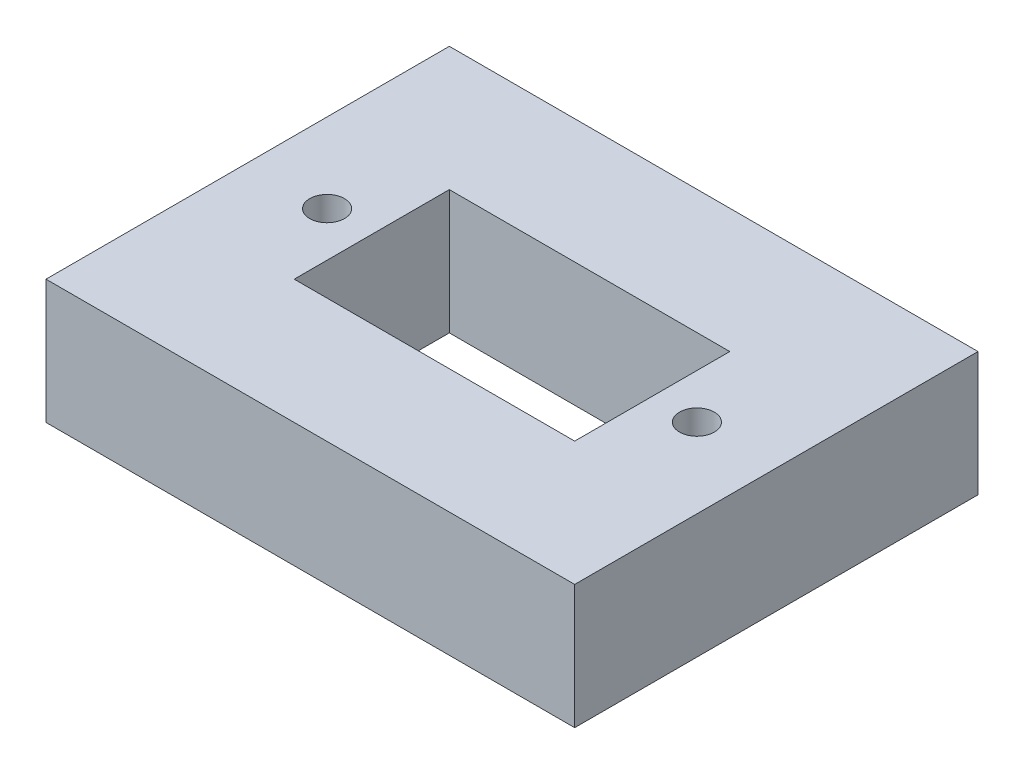
ISO-10303-21;
HEADER;
FILE_DESCRIPTION(('STEP AP214'),'2;1');
FILE_NAME('part.step','',(''),(''),'','','');
FILE_SCHEMA(('AUTOMOTIVE_DESIGN { 1 0 10303 214 1 1 1 1 }'));
ENDSEC;
DATA;
#1=APPLICATION_CONTEXT('core data for automotive mechanical design processes');
#2=APPLICATION_PROTOCOL_DEFINITION('international standard','automotive_design',2000,#1);
#3=PRODUCT_CONTEXT('',#1,'mechanical');
#4=PRODUCT('Part','Part','',(#3));
#5=PRODUCT_RELATED_PRODUCT_CATEGORY('part','',(#4));
#6=PRODUCT_DEFINITION_FORMATION('','',#4);
#7=PRODUCT_DEFINITION_CONTEXT('part definition',#1,'design');
#8=PRODUCT_DEFINITION('design','',#6,#7);
#9=PRODUCT_DEFINITION_SHAPE('','',#8);
#10=(LENGTH_UNIT() NAMED_UNIT(*) SI_UNIT(.MILLI.,.METRE.));
#11=(NAMED_UNIT(*) PLANE_ANGLE_UNIT() SI_UNIT($,.RADIAN.));
#12=(NAMED_UNIT(*) SI_UNIT($,.STERADIAN.) SOLID_ANGLE_UNIT());
#13=UNCERTAINTY_MEASURE_WITH_UNIT(LENGTH_MEASURE(1.E-05),#10,'distance_accuracy_value','');
#14=(GEOMETRIC_REPRESENTATION_CONTEXT(3) GLOBAL_UNCERTAINTY_ASSIGNED_CONTEXT((#13)) GLOBAL_UNIT_ASSIGNED_CONTEXT((#10,
#11,#12)) REPRESENTATION_CONTEXT('',''));
#15=CARTESIAN_POINT('',(0.,0.,0.));
#16=DIRECTION('',(0.,0.,1.));
#17=DIRECTION('',(1.,0.,0.));
#18=AXIS2_PLACEMENT_3D('',#15,#16,#17);
#19=CARTESIAN_POINT('',(0.,10.,0.));
#20=DIRECTION('',(0.,1.,0.));
#21=DIRECTION('',(0.,0.,1.));
#22=AXIS2_PLACEMENT_3D('',#19,#20,#21);
#23=PLANE('',#22);
#24=CARTESIAN_POINT('',(-14.9,10.,0.));
#25=DIRECTION('',(0.,1.,0.));
#26=DIRECTION('',(0.,0.,1.));
#27=AXIS2_PLACEMENT_3D('',#24,#25,#26);
#28=CIRCLE('',#27,1.4);
#29=CARTESIAN_POINT('',(-14.9,10.,1.4));
#30=VERTEX_POINT('',#29);
#31=EDGE_CURVE('E130',#30,#30,#28,.T.);
#32=ORIENTED_EDGE('',*,*,#31,.F.);
#33=EDGE_LOOP('',(#32));
#34=FACE_BOUND('',#33,.T.);
#35=DIRECTION('',(1.,0.,0.));
#36=VECTOR('',#35,1.);
#37=CARTESIAN_POINT('',(-21.3,10.,16.25));
#38=LINE('',#37,#36);
#39=CARTESIAN_POINT('',(-21.3,10.,16.25));
#40=VERTEX_POINT('',#39);
#41=CARTESIAN_POINT('',(21.3,10.,16.25));
#42=VERTEX_POINT('',#41);
#43=EDGE_CURVE('E140',#40,#42,#38,.T.);
#44=ORIENTED_EDGE('',*,*,#43,.T.);
#45=DIRECTION('',(0.,0.,-1.));
#46=VECTOR('',#45,1.);
#47=CARTESIAN_POINT('',(21.3,10.,16.25));
#48=LINE('',#47,#46);
#49=CARTESIAN_POINT('',(21.3,10.,-16.25));
#50=VERTEX_POINT('',#49);
#51=EDGE_CURVE('E143',#42,#50,#48,.T.);
#52=ORIENTED_EDGE('',*,*,#51,.T.);
#53=DIRECTION('',(-1.,0.,0.));
#54=VECTOR('',#53,1.);
#55=CARTESIAN_POINT('',(-21.3,10.,-16.25));
#56=LINE('',#55,#54);
#57=CARTESIAN_POINT('',(-21.3,10.,-16.25));
#58=VERTEX_POINT('',#57);
#59=EDGE_CURVE('E146',#50,#58,#56,.T.);
#60=ORIENTED_EDGE('',*,*,#59,.T.);
#61=DIRECTION('',(0.,0.,1.));
#62=VECTOR('',#61,1.);
#63=CARTESIAN_POINT('',(-21.3,10.,16.25));
#64=LINE('',#63,#62);
#65=EDGE_CURVE('E148',#58,#40,#64,.T.);
#66=ORIENTED_EDGE('',*,*,#65,.T.);
#67=EDGE_LOOP('',(#44,#52,#60,#66));
#68=FACE_BOUND('',#67,.T.);
#69=DIRECTION('',(-1.,0.,0.));
#70=VECTOR('',#69,1.);
#71=CARTESIAN_POINT('',(-11.3,10.,-6.25));
#72=LINE('',#71,#70);
#73=CARTESIAN_POINT('',(11.3,10.,-6.25));
#74=VERTEX_POINT('',#73);
#75=CARTESIAN_POINT('',(-11.3,10.,-6.25));
#76=VERTEX_POINT('',#75);
#77=EDGE_CURVE('E109',#74,#76,#72,.T.);
#78=ORIENTED_EDGE('',*,*,#77,.F.);
#79=DIRECTION('',(0.,0.,-1.));
#80=VECTOR('',#79,1.);
#81=CARTESIAN_POINT('',(11.3,10.,6.25));
#82=LINE('',#81,#80);
#83=CARTESIAN_POINT('',(11.3,10.,6.25));
#84=VERTEX_POINT('',#83);
#85=EDGE_CURVE('E101',#84,#74,#82,.T.);
#86=ORIENTED_EDGE('',*,*,#85,.F.);
#87=DIRECTION('',(1.,0.,0.));
#88=VECTOR('',#87,1.);
#89=CARTESIAN_POINT('',(-11.3,10.,6.25));
#90=LINE('',#89,#88);
#91=CARTESIAN_POINT('',(-11.3,10.,6.25));
#92=VERTEX_POINT('',#91);
#93=EDGE_CURVE('E124',#92,#84,#90,.T.);
#94=ORIENTED_EDGE('',*,*,#93,.F.);
#95=DIRECTION('',(0.,0.,1.));
#96=VECTOR('',#95,1.);
#97=CARTESIAN_POINT('',(-11.3,10.,6.25));
#98=LINE('',#97,#96);
#99=EDGE_CURVE('E122',#76,#92,#98,.T.);
#100=ORIENTED_EDGE('',*,*,#99,.F.);
#101=EDGE_LOOP('',(#78,#86,#94,#100));
#102=FACE_BOUND('',#101,.T.);
#103=CARTESIAN_POINT('',(14.9,10.,0.));
#104=DIRECTION('',(0.,1.,0.));
#105=DIRECTION('',(0.,0.,-1.));
#106=AXIS2_PLACEMENT_3D('',#103,#104,#105);
#107=CIRCLE('',#106,1.4);
#108=CARTESIAN_POINT('',(14.9,10.,-1.4));
#109=VERTEX_POINT('',#108);
#110=EDGE_CURVE('E230',#109,#109,#107,.T.);
#111=ORIENTED_EDGE('',*,*,#110,.F.);
#112=EDGE_LOOP('',(#111));
#113=FACE_BOUND('',#112,.T.);
#114=ADVANCED_FACE('F36',(#34,#68,#102,#113),#23,.T.);
#115=CARTESIAN_POINT('',(0.,0.,0.));
#116=DIRECTION('',(0.,1.,0.));
#117=DIRECTION('',(0.,0.,1.));
#118=AXIS2_PLACEMENT_3D('',#115,#116,#117);
#119=PLANE('',#118);
#120=DIRECTION('',(1.,0.,0.));
#121=VECTOR('',#120,1.);
#122=CARTESIAN_POINT('',(-21.3,0.,16.25));
#123=LINE('',#122,#121);
#124=CARTESIAN_POINT('',(-21.3,0.,16.25));
#125=VERTEX_POINT('',#124);
#126=CARTESIAN_POINT('',(21.3,0.,16.25));
#127=VERTEX_POINT('',#126);
#128=EDGE_CURVE('E117',#125,#127,#123,.T.);
#129=ORIENTED_EDGE('',*,*,#128,.F.);
#130=DIRECTION('',(0.,0.,1.));
#131=VECTOR('',#130,1.);
#132=CARTESIAN_POINT('',(-21.3,0.,16.25));
#133=LINE('',#132,#131);
#134=CARTESIAN_POINT('',(-21.3,0.,-16.25));
#135=VERTEX_POINT('',#134);
#136=EDGE_CURVE('E144',#135,#125,#133,.T.);
#137=ORIENTED_EDGE('',*,*,#136,.F.);
#138=DIRECTION('',(-1.,0.,0.));
#139=VECTOR('',#138,1.);
#140=CARTESIAN_POINT('',(-21.3,0.,-16.25));
#141=LINE('',#140,#139);
#142=CARTESIAN_POINT('',(21.3,0.,-16.25));
#143=VERTEX_POINT('',#142);
#144=EDGE_CURVE('E155',#143,#135,#141,.T.);
#145=ORIENTED_EDGE('',*,*,#144,.F.);
#146=DIRECTION('',(0.,0.,-1.));
#147=VECTOR('',#146,1.);
#148=CARTESIAN_POINT('',(21.3,0.,16.25));
#149=LINE('',#148,#147);
#150=EDGE_CURVE('E153',#127,#143,#149,.T.);
#151=ORIENTED_EDGE('',*,*,#150,.F.);
#152=EDGE_LOOP('',(#129,#137,#145,#151));
#153=FACE_BOUND('',#152,.T.);
#154=DIRECTION('',(0.,0.,-1.));
#155=VECTOR('',#154,1.);
#156=CARTESIAN_POINT('',(11.3,0.,6.25));
#157=LINE('',#156,#155);
#158=CARTESIAN_POINT('',(11.3,0.,6.25));
#159=VERTEX_POINT('',#158);
#160=CARTESIAN_POINT('',(11.3,0.,-6.25));
#161=VERTEX_POINT('',#160);
#162=EDGE_CURVE('E59',#159,#161,#157,.T.);
#163=ORIENTED_EDGE('',*,*,#162,.T.);
#164=DIRECTION('',(-1.,0.,0.));
#165=VECTOR('',#164,1.);
#166=CARTESIAN_POINT('',(-11.3,0.,-6.25));
#167=LINE('',#166,#165);
#168=CARTESIAN_POINT('',(-11.3,0.,-6.25));
#169=VERTEX_POINT('',#168);
#170=EDGE_CURVE('E116',#161,#169,#167,.T.);
#171=ORIENTED_EDGE('',*,*,#170,.T.);
#172=DIRECTION('',(0.,0.,1.));
#173=VECTOR('',#172,1.);
#174=CARTESIAN_POINT('',(-11.3,0.,6.25));
#175=LINE('',#174,#173);
#176=CARTESIAN_POINT('',(-11.3,0.,6.25));
#177=VERTEX_POINT('',#176);
#178=EDGE_CURVE('E132',#169,#177,#175,.T.);
#179=ORIENTED_EDGE('',*,*,#178,.T.);
#180=DIRECTION('',(1.,0.,0.));
#181=VECTOR('',#180,1.);
#182=CARTESIAN_POINT('',(-11.3,0.,6.25));
#183=LINE('',#182,#181);
#184=EDGE_CURVE('E110',#177,#159,#183,.T.);
#185=ORIENTED_EDGE('',*,*,#184,.T.);
#186=EDGE_LOOP('',(#163,#171,#179,#185));
#187=FACE_BOUND('',#186,.T.);
#188=CARTESIAN_POINT('',(-14.9,0.,0.));
#189=DIRECTION('',(0.,1.,0.));
#190=DIRECTION('',(0.,0.,1.));
#191=AXIS2_PLACEMENT_3D('',#188,#189,#190);
#192=CIRCLE('',#191,1.4);
#193=CARTESIAN_POINT('',(-14.9,0.,1.4));
#194=VERTEX_POINT('',#193);
#195=EDGE_CURVE('E236',#194,#194,#192,.T.);
#196=ORIENTED_EDGE('',*,*,#195,.T.);
#197=EDGE_LOOP('',(#196));
#198=FACE_BOUND('',#197,.T.);
#199=CARTESIAN_POINT('',(14.9,0.,0.));
#200=DIRECTION('',(0.,1.,0.));
#201=DIRECTION('',(0.,0.,-1.));
#202=AXIS2_PLACEMENT_3D('',#199,#200,#201);
#203=CIRCLE('',#202,1.4);
#204=CARTESIAN_POINT('',(14.9,0.,-1.4));
#205=VERTEX_POINT('',#204);
#206=EDGE_CURVE('E233',#205,#205,#203,.T.);
#207=ORIENTED_EDGE('',*,*,#206,.T.);
#208=EDGE_LOOP('',(#207));
#209=FACE_BOUND('',#208,.T.);
#210=ADVANCED_FACE('F173',(#153,#187,#198,#209),#119,.F.);
#211=CARTESIAN_POINT('',(-21.3,10.,16.25));
#212=DIRECTION('',(0.,0.,-1.));
#213=DIRECTION('',(-1.,0.,0.));
#214=AXIS2_PLACEMENT_3D('',#211,#212,#213);
#215=PLANE('',#214);
#216=ORIENTED_EDGE('',*,*,#128,.T.);
#217=DIRECTION('',(0.,-1.,0.));
#218=VECTOR('',#217,1.);
#219=CARTESIAN_POINT('',(21.3,10.,16.25));
#220=LINE('',#219,#218);
#221=EDGE_CURVE('E11',#42,#127,#220,.T.);
#222=ORIENTED_EDGE('',*,*,#221,.F.);
#223=ORIENTED_EDGE('',*,*,#43,.F.);
#224=DIRECTION('',(0.,-1.,0.));
#225=VECTOR('',#224,1.);
#226=CARTESIAN_POINT('',(-21.3,10.,16.25));
#227=LINE('',#226,#225);
#228=EDGE_CURVE('E150',#40,#125,#227,.T.);
#229=ORIENTED_EDGE('',*,*,#228,.T.);
#230=EDGE_LOOP('',(#216,#222,#223,#229));
#231=FACE_BOUND('',#230,.T.);
#232=ADVANCED_FACE('F38',(#231),#215,.F.);
#233=CARTESIAN_POINT('',(21.3,10.,16.25));
#234=DIRECTION('',(-1.,0.,0.));
#235=DIRECTION('',(0.,0.,1.));
#236=AXIS2_PLACEMENT_3D('',#233,#234,#235);
#237=PLANE('',#236);
#238=ORIENTED_EDGE('',*,*,#150,.T.);
#239=DIRECTION('',(0.,-1.,0.));
#240=VECTOR('',#239,1.);
#241=CARTESIAN_POINT('',(21.3,10.,-16.25));
#242=LINE('',#241,#240);
#243=EDGE_CURVE('E44',#50,#143,#242,.T.);
#244=ORIENTED_EDGE('',*,*,#243,.F.);
#245=ORIENTED_EDGE('',*,*,#51,.F.);
#246=ORIENTED_EDGE('',*,*,#221,.T.);
#247=EDGE_LOOP('',(#238,#244,#245,#246));
#248=FACE_BOUND('',#247,.T.);
#249=ADVANCED_FACE('F183',(#248),#237,.F.);
#250=CARTESIAN_POINT('',(-21.3,10.,-16.25));
#251=DIRECTION('',(0.,0.,1.));
#252=DIRECTION('',(1.,0.,0.));
#253=AXIS2_PLACEMENT_3D('',#250,#251,#252);
#254=PLANE('',#253);
#255=ORIENTED_EDGE('',*,*,#144,.T.);
#256=DIRECTION('',(0.,-1.,0.));
#257=VECTOR('',#256,1.);
#258=CARTESIAN_POINT('',(-21.3,10.,-16.25));
#259=LINE('',#258,#257);
#260=EDGE_CURVE('E160',#58,#135,#259,.T.);
#261=ORIENTED_EDGE('',*,*,#260,.F.);
#262=ORIENTED_EDGE('',*,*,#59,.F.);
#263=ORIENTED_EDGE('',*,*,#243,.T.);
#264=EDGE_LOOP('',(#255,#261,#262,#263));
#265=FACE_BOUND('',#264,.T.);
#266=ADVANCED_FACE('F167',(#265),#254,.F.);
#267=CARTESIAN_POINT('',(-21.3,10.,16.25));
#268=DIRECTION('',(1.,0.,0.));
#269=DIRECTION('',(0.,0.,-1.));
#270=AXIS2_PLACEMENT_3D('',#267,#268,#269);
#271=PLANE('',#270);
#272=ORIENTED_EDGE('',*,*,#136,.T.);
#273=ORIENTED_EDGE('',*,*,#228,.F.);
#274=ORIENTED_EDGE('',*,*,#65,.F.);
#275=ORIENTED_EDGE('',*,*,#260,.T.);
#276=EDGE_LOOP('',(#272,#273,#274,#275));
#277=FACE_BOUND('',#276,.T.);
#278=ADVANCED_FACE('F177',(#277),#271,.F.);
#279=CARTESIAN_POINT('',(11.3,10.,6.25));
#280=DIRECTION('',(-1.,0.,0.));
#281=DIRECTION('',(0.,0.,1.));
#282=AXIS2_PLACEMENT_3D('',#279,#280,#281);
#283=PLANE('',#282);
#284=ORIENTED_EDGE('',*,*,#162,.F.);
#285=DIRECTION('',(0.,-1.,0.));
#286=VECTOR('',#285,1.);
#287=CARTESIAN_POINT('',(11.3,10.,6.25));
#288=LINE('',#287,#286);
#289=EDGE_CURVE('E105',#84,#159,#288,.T.);
#290=ORIENTED_EDGE('',*,*,#289,.F.);
#291=ORIENTED_EDGE('',*,*,#85,.T.);
#292=DIRECTION('',(0.,-1.,0.));
#293=VECTOR('',#292,1.);
#294=CARTESIAN_POINT('',(11.3,10.,-6.25));
#295=LINE('',#294,#293);
#296=EDGE_CURVE('E104',#74,#161,#295,.T.);
#297=ORIENTED_EDGE('',*,*,#296,.T.);
#298=EDGE_LOOP('',(#284,#290,#291,#297));
#299=FACE_BOUND('',#298,.T.);
#300=ADVANCED_FACE('F103',(#299),#283,.T.);
#301=CARTESIAN_POINT('',(-11.3,10.,-6.25));
#302=DIRECTION('',(0.,0.,1.));
#303=DIRECTION('',(1.,0.,0.));
#304=AXIS2_PLACEMENT_3D('',#301,#302,#303);
#305=PLANE('',#304);
#306=ORIENTED_EDGE('',*,*,#170,.F.);
#307=ORIENTED_EDGE('',*,*,#296,.F.);
#308=ORIENTED_EDGE('',*,*,#77,.T.);
#309=DIRECTION('',(0.,-1.,0.));
#310=VECTOR('',#309,1.);
#311=CARTESIAN_POINT('',(-11.3,10.,-6.25));
#312=LINE('',#311,#310);
#313=EDGE_CURVE('E118',#76,#169,#312,.T.);
#314=ORIENTED_EDGE('',*,*,#313,.T.);
#315=EDGE_LOOP('',(#306,#307,#308,#314));
#316=FACE_BOUND('',#315,.T.);
#317=ADVANCED_FACE('F113',(#316),#305,.T.);
#318=CARTESIAN_POINT('',(-11.3,10.,6.25));
#319=DIRECTION('',(1.,0.,0.));
#320=DIRECTION('',(0.,0.,-1.));
#321=AXIS2_PLACEMENT_3D('',#318,#319,#320);
#322=PLANE('',#321);
#323=ORIENTED_EDGE('',*,*,#178,.F.);
#324=ORIENTED_EDGE('',*,*,#313,.F.);
#325=ORIENTED_EDGE('',*,*,#99,.T.);
#326=DIRECTION('',(0.,-1.,0.));
#327=VECTOR('',#326,1.);
#328=CARTESIAN_POINT('',(-11.3,10.,6.25));
#329=LINE('',#328,#327);
#330=EDGE_CURVE('E51',#92,#177,#329,.T.);
#331=ORIENTED_EDGE('',*,*,#330,.T.);
#332=EDGE_LOOP('',(#323,#324,#325,#331));
#333=FACE_BOUND('',#332,.T.);
#334=ADVANCED_FACE('F208',(#333),#322,.T.);
#335=CARTESIAN_POINT('',(-11.3,10.,6.25));
#336=DIRECTION('',(0.,0.,-1.));
#337=DIRECTION('',(-1.,0.,0.));
#338=AXIS2_PLACEMENT_3D('',#335,#336,#337);
#339=PLANE('',#338);
#340=ORIENTED_EDGE('',*,*,#184,.F.);
#341=ORIENTED_EDGE('',*,*,#330,.F.);
#342=ORIENTED_EDGE('',*,*,#93,.T.);
#343=ORIENTED_EDGE('',*,*,#289,.T.);
#344=EDGE_LOOP('',(#340,#341,#342,#343));
#345=FACE_BOUND('',#344,.T.);
#346=ADVANCED_FACE('F212',(#345),#339,.T.);
#347=CARTESIAN_POINT('',(-14.9,10.,0.));
#348=DIRECTION('',(0.,-1.,0.));
#349=DIRECTION('',(0.,0.,-1.));
#350=AXIS2_PLACEMENT_3D('',#347,#348,#349);
#351=CYLINDRICAL_SURFACE('',#350,1.4);
#352=ORIENTED_EDGE('',*,*,#31,.T.);
#353=EDGE_LOOP('',(#352));
#354=FACE_BOUND('',#353,.T.);
#355=ORIENTED_EDGE('',*,*,#195,.F.);
#356=EDGE_LOOP('',(#355));
#357=FACE_BOUND('',#356,.T.);
#358=ADVANCED_FACE('F218',(#354,#357),#351,.F.);
#359=CARTESIAN_POINT('',(14.9,10.,0.));
#360=DIRECTION('',(0.,-1.,0.));
#361=DIRECTION('',(0.,0.,-1.));
#362=AXIS2_PLACEMENT_3D('',#359,#360,#361);
#363=CYLINDRICAL_SURFACE('',#362,1.4);
#364=ORIENTED_EDGE('',*,*,#110,.T.);
#365=EDGE_LOOP('',(#364));
#366=FACE_BOUND('',#365,.T.);
#367=ORIENTED_EDGE('',*,*,#206,.F.);
#368=EDGE_LOOP('',(#367));
#369=FACE_BOUND('',#368,.T.);
#370=ADVANCED_FACE('F221',(#366,#369),#363,.F.);
#371=CLOSED_SHELL('',(#114,#210,#232,#249,#266,#278,#300,#317,#334,#346,#358,#370));
#372=MANIFOLD_SOLID_BREP('B2',#371);
#373=ADVANCED_BREP_SHAPE_REPRESENTATION('',(#18,#372),#14);
#374=SHAPE_DEFINITION_REPRESENTATION(#9,#373);
ENDSEC;
END-ISO-10303-21;
